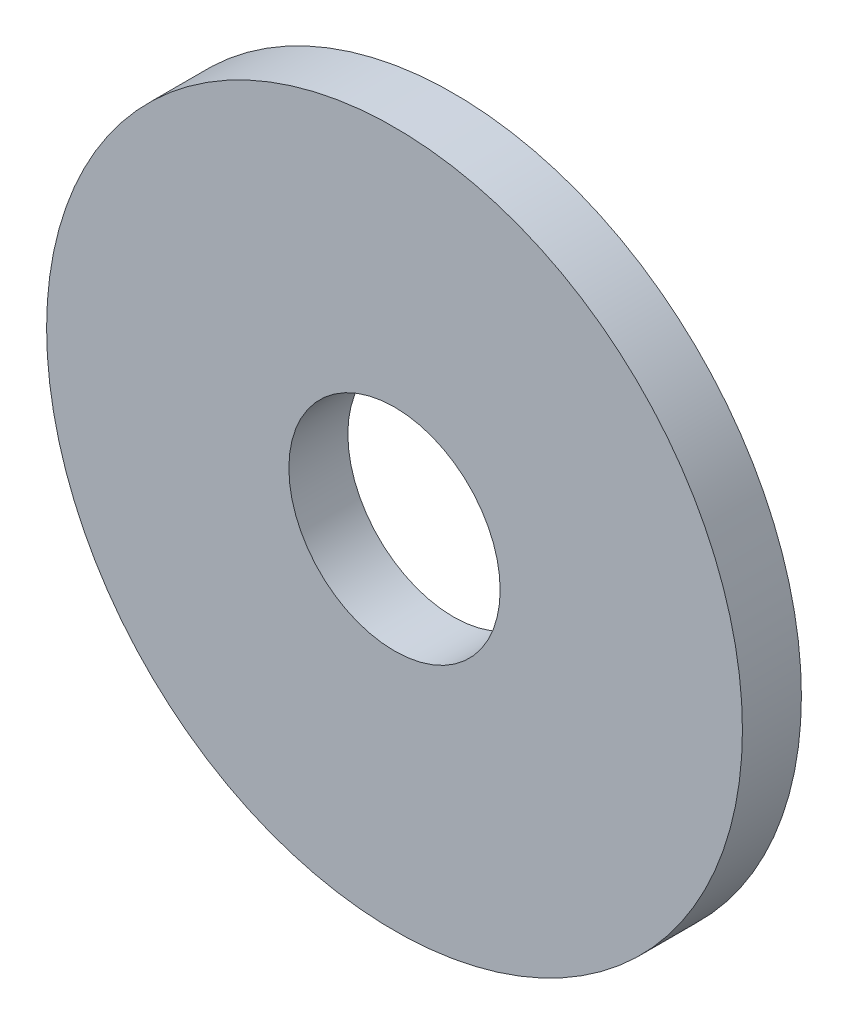
ISO-10303-21;
HEADER;
FILE_DESCRIPTION(('STEP AP214'),'2;1');
FILE_NAME('part.step','',(''),(''),'','','');
FILE_SCHEMA(('AUTOMOTIVE_DESIGN { 1 0 10303 214 1 1 1 1 }'));
ENDSEC;
DATA;
#1=APPLICATION_CONTEXT('core data for automotive mechanical design processes');
#2=APPLICATION_PROTOCOL_DEFINITION('international standard','automotive_design',2000,#1);
#3=PRODUCT_CONTEXT('',#1,'mechanical');
#4=PRODUCT('Part','Part','',(#3));
#5=PRODUCT_RELATED_PRODUCT_CATEGORY('part','',(#4));
#6=PRODUCT_DEFINITION_FORMATION('','',#4);
#7=PRODUCT_DEFINITION_CONTEXT('part definition',#1,'design');
#8=PRODUCT_DEFINITION('design','',#6,#7);
#9=PRODUCT_DEFINITION_SHAPE('','',#8);
#10=(LENGTH_UNIT() NAMED_UNIT(*) SI_UNIT(.MILLI.,.METRE.));
#11=(NAMED_UNIT(*) PLANE_ANGLE_UNIT() SI_UNIT($,.RADIAN.));
#12=(NAMED_UNIT(*) SI_UNIT($,.STERADIAN.) SOLID_ANGLE_UNIT());
#13=UNCERTAINTY_MEASURE_WITH_UNIT(LENGTH_MEASURE(1.E-05),#10,'distance_accuracy_value','');
#14=(GEOMETRIC_REPRESENTATION_CONTEXT(3) GLOBAL_UNCERTAINTY_ASSIGNED_CONTEXT((#13)) GLOBAL_UNIT_ASSIGNED_CONTEXT((#10,
#11,#12)) REPRESENTATION_CONTEXT('',''));
#15=CARTESIAN_POINT('',(0.,0.,0.));
#16=DIRECTION('',(0.,0.,1.));
#17=DIRECTION('',(1.,0.,0.));
#18=AXIS2_PLACEMENT_3D('',#15,#16,#17);
#19=CARTESIAN_POINT('',(0.,0.,0.6));
#20=DIRECTION('',(0.,0.,1.));
#21=DIRECTION('',(1.,0.,0.));
#22=AXIS2_PLACEMENT_3D('',#19,#20,#21);
#23=PLANE('',#22);
#24=CARTESIAN_POINT('',(0.,0.,0.6));
#25=DIRECTION('',(0.,0.,1.));
#26=DIRECTION('',(1.,0.,0.));
#27=AXIS2_PLACEMENT_3D('',#24,#25,#26);
#28=CIRCLE('',#27,7.08);
#29=CARTESIAN_POINT('',(7.08,0.,0.6));
#30=VERTEX_POINT('',#29);
#31=EDGE_CURVE('E10',#30,#30,#28,.T.);
#32=ORIENTED_EDGE('',*,*,#31,.T.);
#33=EDGE_LOOP('',(#32));
#34=FACE_BOUND('',#33,.T.);
#35=CARTESIAN_POINT('',(0.,0.,0.6));
#36=DIRECTION('',(0.,0.,1.));
#37=DIRECTION('',(1.,0.,0.));
#38=AXIS2_PLACEMENT_3D('',#35,#36,#37);
#39=CIRCLE('',#38,2.15);
#40=CARTESIAN_POINT('',(2.15,0.,0.6));
#41=VERTEX_POINT('',#40);
#42=EDGE_CURVE('E50',#41,#41,#39,.T.);
#43=ORIENTED_EDGE('',*,*,#42,.F.);
#44=EDGE_LOOP('',(#43));
#45=FACE_BOUND('',#44,.T.);
#46=ADVANCED_FACE('F39',(#34,#45),#23,.T.);
#47=CARTESIAN_POINT('',(0.,0.,-0.6));
#48=DIRECTION('',(0.,0.,1.));
#49=DIRECTION('',(1.,0.,0.));
#50=AXIS2_PLACEMENT_3D('',#47,#48,#49);
#51=PLANE('',#50);
#52=CARTESIAN_POINT('',(0.,0.,-0.6));
#53=DIRECTION('',(0.,0.,1.));
#54=DIRECTION('',(1.,0.,0.));
#55=AXIS2_PLACEMENT_3D('',#52,#53,#54);
#56=CIRCLE('',#55,7.08);
#57=CARTESIAN_POINT('',(7.08,0.,-0.6));
#58=VERTEX_POINT('',#57);
#59=EDGE_CURVE('E43',#58,#58,#56,.T.);
#60=ORIENTED_EDGE('',*,*,#59,.F.);
#61=EDGE_LOOP('',(#60));
#62=FACE_BOUND('',#61,.T.);
#63=CARTESIAN_POINT('',(0.,0.,-0.6));
#64=DIRECTION('',(0.,0.,1.));
#65=DIRECTION('',(1.,0.,0.));
#66=AXIS2_PLACEMENT_3D('',#63,#64,#65);
#67=CIRCLE('',#66,2.15);
#68=CARTESIAN_POINT('',(2.15,0.,-0.6));
#69=VERTEX_POINT('',#68);
#70=EDGE_CURVE('E52',#69,#69,#67,.T.);
#71=ORIENTED_EDGE('',*,*,#70,.T.);
#72=EDGE_LOOP('',(#71));
#73=FACE_BOUND('',#72,.T.);
#74=ADVANCED_FACE('F62',(#62,#73),#51,.F.);
#75=CARTESIAN_POINT('',(0.,0.,0.6));
#76=DIRECTION('',(0.,0.,-1.));
#77=DIRECTION('',(-1.,0.,0.));
#78=AXIS2_PLACEMENT_3D('',#75,#76,#77);
#79=CYLINDRICAL_SURFACE('',#78,7.08);
#80=ORIENTED_EDGE('',*,*,#31,.F.);
#81=EDGE_LOOP('',(#80));
#82=FACE_BOUND('',#81,.T.);
#83=ORIENTED_EDGE('',*,*,#59,.T.);
#84=EDGE_LOOP('',(#83));
#85=FACE_BOUND('',#84,.T.);
#86=ADVANCED_FACE('F41',(#82,#85),#79,.T.);
#87=CARTESIAN_POINT('',(0.,0.,0.6));
#88=DIRECTION('',(0.,0.,-1.));
#89=DIRECTION('',(-1.,0.,0.));
#90=AXIS2_PLACEMENT_3D('',#87,#88,#89);
#91=CYLINDRICAL_SURFACE('',#90,2.15);
#92=ORIENTED_EDGE('',*,*,#42,.T.);
#93=EDGE_LOOP('',(#92));
#94=FACE_BOUND('',#93,.T.);
#95=ORIENTED_EDGE('',*,*,#70,.F.);
#96=EDGE_LOOP('',(#95));
#97=FACE_BOUND('',#96,.T.);
#98=ADVANCED_FACE('F58',(#94,#97),#91,.F.);
#99=CLOSED_SHELL('',(#46,#74,#86,#98));
#100=MANIFOLD_SOLID_BREP('B2',#99);
#101=ADVANCED_BREP_SHAPE_REPRESENTATION('',(#18,#100),#14);
#102=SHAPE_DEFINITION_REPRESENTATION(#9,#101);
ENDSEC;
END-ISO-10303-21;
